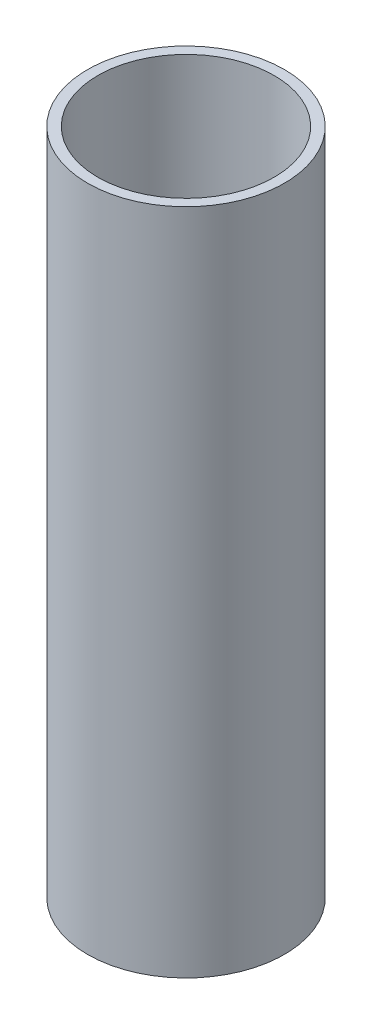
ISO-10303-21;
HEADER;
FILE_DESCRIPTION(('STEP AP214'),'2;1');
FILE_NAME('part.step','',(''),(''),'','','');
FILE_SCHEMA(('AUTOMOTIVE_DESIGN { 1 0 10303 214 1 1 1 1 }'));
ENDSEC;
DATA;
#1=APPLICATION_CONTEXT('core data for automotive mechanical design processes');
#2=APPLICATION_PROTOCOL_DEFINITION('international standard','automotive_design',2000,#1);
#3=PRODUCT_CONTEXT('',#1,'mechanical');
#4=PRODUCT('Part','Part','',(#3));
#5=PRODUCT_RELATED_PRODUCT_CATEGORY('part','',(#4));
#6=PRODUCT_DEFINITION_FORMATION('','',#4);
#7=PRODUCT_DEFINITION_CONTEXT('part definition',#1,'design');
#8=PRODUCT_DEFINITION('design','',#6,#7);
#9=PRODUCT_DEFINITION_SHAPE('','',#8);
#10=(LENGTH_UNIT() NAMED_UNIT(*) SI_UNIT(.MILLI.,.METRE.));
#11=(NAMED_UNIT(*) PLANE_ANGLE_UNIT() SI_UNIT($,.RADIAN.));
#12=(NAMED_UNIT(*) SI_UNIT($,.STERADIAN.) SOLID_ANGLE_UNIT());
#13=UNCERTAINTY_MEASURE_WITH_UNIT(LENGTH_MEASURE(1.E-05),#10,'distance_accuracy_value','');
#14=(GEOMETRIC_REPRESENTATION_CONTEXT(3) GLOBAL_UNCERTAINTY_ASSIGNED_CONTEXT((#13)) GLOBAL_UNIT_ASSIGNED_CONTEXT((#10,
#11,#12)) REPRESENTATION_CONTEXT('',''));
#15=CARTESIAN_POINT('',(0.,0.,0.));
#16=DIRECTION('',(0.,0.,1.));
#17=DIRECTION('',(1.,0.,0.));
#18=AXIS2_PLACEMENT_3D('',#15,#16,#17);
#19=CARTESIAN_POINT('',(-4.12963655514263,65.,-1.39125135416304));
#20=DIRECTION('',(0.,1.,0.));
#21=DIRECTION('',(0.,0.,1.));
#22=AXIS2_PLACEMENT_3D('',#19,#20,#21);
#23=PLANE('',#22);
#24=CARTESIAN_POINT('',(-4.12963655514263,65.,-1.39125135416304));
#25=DIRECTION('',(0.,1.,0.));
#26=DIRECTION('',(0.,0.,1.));
#27=AXIS2_PLACEMENT_3D('',#24,#25,#26);
#28=CIRCLE('',#27,19.1633693976877);
#29=CARTESIAN_POINT('',(-4.12963655514263,65.,17.7721180435246));
#30=VERTEX_POINT('',#29);
#31=EDGE_CURVE('E10',#30,#30,#28,.T.);
#32=ORIENTED_EDGE('',*,*,#31,.T.);
#33=EDGE_LOOP('',(#32));
#34=FACE_BOUND('',#33,.T.);
#35=CARTESIAN_POINT('',(-4.12963655514263,65.,-1.39125135416304));
#36=DIRECTION('',(0.,1.,0.));
#37=DIRECTION('',(0.,0.,1.));
#38=AXIS2_PLACEMENT_3D('',#35,#36,#37);
#39=CIRCLE('',#38,17.1633693976877);
#40=CARTESIAN_POINT('',(-4.12963655514263,65.,15.7721180435247));
#41=VERTEX_POINT('',#40);
#42=EDGE_CURVE('E42',#41,#41,#39,.T.);
#43=ORIENTED_EDGE('',*,*,#42,.F.);
#44=EDGE_LOOP('',(#43));
#45=FACE_BOUND('',#44,.T.);
#46=ADVANCED_FACE('F31',(#34,#45),#23,.T.);
#47=CARTESIAN_POINT('',(-4.12963655514263,-65.,-1.39125135416304));
#48=DIRECTION('',(0.,1.,0.));
#49=DIRECTION('',(0.,0.,1.));
#50=AXIS2_PLACEMENT_3D('',#47,#48,#49);
#51=PLANE('',#50);
#52=CARTESIAN_POINT('',(-4.12963655514263,-65.,-1.39125135416304));
#53=DIRECTION('',(0.,1.,0.));
#54=DIRECTION('',(0.,0.,1.));
#55=AXIS2_PLACEMENT_3D('',#52,#53,#54);
#56=CIRCLE('',#55,19.1633693976877);
#57=CARTESIAN_POINT('',(-4.12963655514263,-65.,17.7721180435246));
#58=VERTEX_POINT('',#57);
#59=EDGE_CURVE('E35',#58,#58,#56,.T.);
#60=ORIENTED_EDGE('',*,*,#59,.F.);
#61=EDGE_LOOP('',(#60));
#62=FACE_BOUND('',#61,.T.);
#63=CARTESIAN_POINT('',(-4.12963655514263,-65.,-1.39125135416304));
#64=DIRECTION('',(0.,1.,0.));
#65=DIRECTION('',(0.,0.,1.));
#66=AXIS2_PLACEMENT_3D('',#63,#64,#65);
#67=CIRCLE('',#66,17.1633693976877);
#68=CARTESIAN_POINT('',(-4.12963655514263,-65.,15.7721180435247));
#69=VERTEX_POINT('',#68);
#70=EDGE_CURVE('E44',#69,#69,#67,.T.);
#71=ORIENTED_EDGE('',*,*,#70,.T.);
#72=EDGE_LOOP('',(#71));
#73=FACE_BOUND('',#72,.T.);
#74=ADVANCED_FACE('F54',(#62,#73),#51,.F.);
#75=CARTESIAN_POINT('',(-4.12963655514263,65.,-1.39125135416304));
#76=DIRECTION('',(0.,-1.,0.));
#77=DIRECTION('',(0.,0.,-1.));
#78=AXIS2_PLACEMENT_3D('',#75,#76,#77);
#79=CYLINDRICAL_SURFACE('',#78,19.1633693976877);
#80=ORIENTED_EDGE('',*,*,#31,.F.);
#81=EDGE_LOOP('',(#80));
#82=FACE_BOUND('',#81,.T.);
#83=ORIENTED_EDGE('',*,*,#59,.T.);
#84=EDGE_LOOP('',(#83));
#85=FACE_BOUND('',#84,.T.);
#86=ADVANCED_FACE('F33',(#82,#85),#79,.T.);
#87=CARTESIAN_POINT('',(-4.12963655514263,65.,-1.39125135416304));
#88=DIRECTION('',(0.,-1.,0.));
#89=DIRECTION('',(0.,0.,-1.));
#90=AXIS2_PLACEMENT_3D('',#87,#88,#89);
#91=CYLINDRICAL_SURFACE('',#90,17.1633693976877);
#92=ORIENTED_EDGE('',*,*,#42,.T.);
#93=EDGE_LOOP('',(#92));
#94=FACE_BOUND('',#93,.T.);
#95=ORIENTED_EDGE('',*,*,#70,.F.);
#96=EDGE_LOOP('',(#95));
#97=FACE_BOUND('',#96,.T.);
#98=ADVANCED_FACE('F50',(#94,#97),#91,.F.);
#99=CLOSED_SHELL('',(#46,#74,#86,#98));
#100=MANIFOLD_SOLID_BREP('B2',#99);
#101=ADVANCED_BREP_SHAPE_REPRESENTATION('',(#18,#100),#14);
#102=SHAPE_DEFINITION_REPRESENTATION(#9,#101);
ENDSEC;
END-ISO-10303-21;
